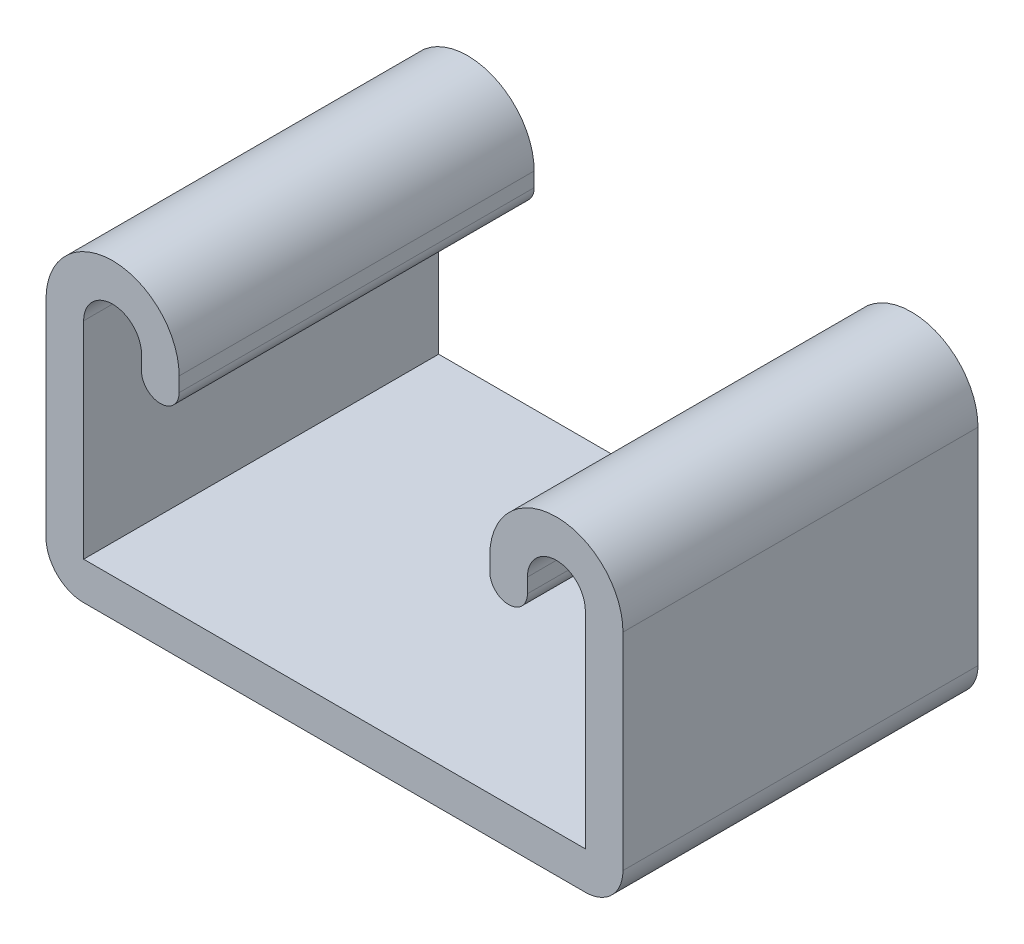
ISO-10303-21;
HEADER;
FILE_DESCRIPTION(('STEP AP214'),'2;1');
FILE_NAME('part.step','',(''),(''),'','','');
FILE_SCHEMA(('AUTOMOTIVE_DESIGN { 1 0 10303 214 1 1 1 1 }'));
ENDSEC;
DATA;
#1=APPLICATION_CONTEXT('core data for automotive mechanical design processes');
#2=APPLICATION_PROTOCOL_DEFINITION('international standard','automotive_design',2000,#1);
#3=PRODUCT_CONTEXT('',#1,'mechanical');
#4=PRODUCT('Part','Part','',(#3));
#5=PRODUCT_RELATED_PRODUCT_CATEGORY('part','',(#4));
#6=PRODUCT_DEFINITION_FORMATION('','',#4);
#7=PRODUCT_DEFINITION_CONTEXT('part definition',#1,'design');
#8=PRODUCT_DEFINITION('design','',#6,#7);
#9=PRODUCT_DEFINITION_SHAPE('','',#8);
#10=(LENGTH_UNIT() NAMED_UNIT(*) SI_UNIT(.MILLI.,.METRE.));
#11=(NAMED_UNIT(*) PLANE_ANGLE_UNIT() SI_UNIT($,.RADIAN.));
#12=(NAMED_UNIT(*) SI_UNIT($,.STERADIAN.) SOLID_ANGLE_UNIT());
#13=UNCERTAINTY_MEASURE_WITH_UNIT(LENGTH_MEASURE(1.E-05),#10,'distance_accuracy_value','');
#14=(GEOMETRIC_REPRESENTATION_CONTEXT(3) GLOBAL_UNCERTAINTY_ASSIGNED_CONTEXT((#13)) GLOBAL_UNIT_ASSIGNED_CONTEXT((#10,
#11,#12)) REPRESENTATION_CONTEXT('',''));
#15=CARTESIAN_POINT('',(0.,0.,0.));
#16=DIRECTION('',(0.,0.,1.));
#17=DIRECTION('',(1.,0.,0.));
#18=AXIS2_PLACEMENT_3D('',#15,#16,#17);
#19=CARTESIAN_POINT('',(-15.875,8.3693,12.7));
#20=DIRECTION('',(0.,0.,-1.));
#21=DIRECTION('',(-1.,0.,0.));
#22=AXIS2_PLACEMENT_3D('',#19,#20,#21);
#23=CYLINDRICAL_SURFACE('',#22,4.7625);
#24=CARTESIAN_POINT('',(-15.875,8.3693,-12.7));
#25=DIRECTION('',(0.,0.,1.));
#26=DIRECTION('',(-1.,0.,0.));
#27=AXIS2_PLACEMENT_3D('',#24,#25,#26);
#28=CIRCLE('',#27,4.7625);
#29=CARTESIAN_POINT('',(-11.1125,8.3693,-12.7));
#30=VERTEX_POINT('',#29);
#31=CARTESIAN_POINT('',(-20.6375,8.3693,-12.7));
#32=VERTEX_POINT('',#31);
#33=EDGE_CURVE('E188',#30,#32,#28,.T.);
#34=ORIENTED_EDGE('',*,*,#33,.T.);
#35=DIRECTION('',(0.,0.,-1.));
#36=VECTOR('',#35,1.);
#37=CARTESIAN_POINT('',(-20.6375,8.3693,12.7));
#38=LINE('',#37,#36);
#39=CARTESIAN_POINT('',(-20.6375,8.3693,12.7));
#40=VERTEX_POINT('',#39);
#41=EDGE_CURVE('E11',#40,#32,#38,.T.);
#42=ORIENTED_EDGE('',*,*,#41,.F.);
#43=CARTESIAN_POINT('',(-15.875,8.3693,12.7));
#44=DIRECTION('',(0.,0.,1.));
#45=DIRECTION('',(-1.,0.,0.));
#46=AXIS2_PLACEMENT_3D('',#43,#44,#45);
#47=CIRCLE('',#46,4.7625);
#48=CARTESIAN_POINT('',(-11.1125,8.3693,12.7));
#49=VERTEX_POINT('',#48);
#50=EDGE_CURVE('E222',#49,#40,#47,.T.);
#51=ORIENTED_EDGE('',*,*,#50,.F.);
#52=DIRECTION('',(0.,0.,-1.));
#53=VECTOR('',#52,1.);
#54=CARTESIAN_POINT('',(-11.1125,8.3693,12.7));
#55=LINE('',#54,#53);
#56=EDGE_CURVE('E184',#49,#30,#55,.T.);
#57=ORIENTED_EDGE('',*,*,#56,.T.);
#58=EDGE_LOOP('',(#34,#42,#51,#57));
#59=FACE_BOUND('',#58,.T.);
#60=ADVANCED_FACE('F32',(#59),#23,.T.);
#61=CARTESIAN_POINT('',(-20.6375,8.3693,12.7));
#62=DIRECTION('',(1.,0.,0.));
#63=DIRECTION('',(0.,1.,0.));
#64=AXIS2_PLACEMENT_3D('',#61,#62,#63);
#65=PLANE('',#64);
#66=DIRECTION('',(0.,-1.,0.));
#67=VECTOR('',#66,1.);
#68=CARTESIAN_POINT('',(-20.6375,8.3693,-12.7));
#69=LINE('',#68,#67);
#70=CARTESIAN_POINT('',(-20.6375,-6.4008,-12.7));
#71=VERTEX_POINT('',#70);
#72=EDGE_CURVE('E191',#32,#71,#69,.T.);
#73=ORIENTED_EDGE('',*,*,#72,.T.);
#74=DIRECTION('',(0.,0.,-1.));
#75=VECTOR('',#74,1.);
#76=CARTESIAN_POINT('',(-20.6375,-6.4008,12.7));
#77=LINE('',#76,#75);
#78=CARTESIAN_POINT('',(-20.6375,-6.4008,12.7));
#79=VERTEX_POINT('',#78);
#80=EDGE_CURVE('E40',#79,#71,#77,.T.);
#81=ORIENTED_EDGE('',*,*,#80,.F.);
#82=DIRECTION('',(0.,-1.,0.));
#83=VECTOR('',#82,1.);
#84=CARTESIAN_POINT('',(-20.6375,8.3693,12.7));
#85=LINE('',#84,#83);
#86=EDGE_CURVE('E121',#40,#79,#85,.T.);
#87=ORIENTED_EDGE('',*,*,#86,.F.);
#88=ORIENTED_EDGE('',*,*,#41,.T.);
#89=EDGE_LOOP('',(#73,#81,#87,#88));
#90=FACE_BOUND('',#89,.T.);
#91=ADVANCED_FACE('F330',(#90),#65,.F.);
#92=CARTESIAN_POINT('',(-17.9451,-6.4008,12.7));
#93=DIRECTION('',(0.,0.,-1.));
#94=DIRECTION('',(-1.,0.,0.));
#95=AXIS2_PLACEMENT_3D('',#92,#93,#94);
#96=CYLINDRICAL_SURFACE('',#95,2.6924);
#97=CARTESIAN_POINT('',(-17.9451,-6.4008,-12.7));
#98=DIRECTION('',(0.,0.,1.));
#99=DIRECTION('',(-1.,0.,0.));
#100=AXIS2_PLACEMENT_3D('',#97,#98,#99);
#101=CIRCLE('',#100,2.6924);
#102=CARTESIAN_POINT('',(-17.9451,-9.0932,-12.7));
#103=VERTEX_POINT('',#102);
#104=EDGE_CURVE('E193',#71,#103,#101,.T.);
#105=ORIENTED_EDGE('',*,*,#104,.T.);
#106=DIRECTION('',(0.,0.,-1.));
#107=VECTOR('',#106,1.);
#108=CARTESIAN_POINT('',(-17.9451,-9.0932,12.7));
#109=LINE('',#108,#107);
#110=CARTESIAN_POINT('',(-17.9451,-9.0932,12.7));
#111=VERTEX_POINT('',#110);
#112=EDGE_CURVE('E259',#111,#103,#109,.T.);
#113=ORIENTED_EDGE('',*,*,#112,.F.);
#114=CARTESIAN_POINT('',(-17.9451,-6.4008,12.7));
#115=DIRECTION('',(0.,0.,1.));
#116=DIRECTION('',(-1.,0.,0.));
#117=AXIS2_PLACEMENT_3D('',#114,#115,#116);
#118=CIRCLE('',#117,2.6924);
#119=EDGE_CURVE('E267',#79,#111,#118,.T.);
#120=ORIENTED_EDGE('',*,*,#119,.F.);
#121=ORIENTED_EDGE('',*,*,#80,.T.);
#122=EDGE_LOOP('',(#105,#113,#120,#121));
#123=FACE_BOUND('',#122,.T.);
#124=ADVANCED_FACE('F265',(#123),#96,.T.);
#125=CARTESIAN_POINT('',(-17.9451,-9.0932,12.7));
#126=DIRECTION('',(0.,1.,0.));
#127=DIRECTION('',(0.,0.,1.));
#128=AXIS2_PLACEMENT_3D('',#125,#126,#127);
#129=PLANE('',#128);
#130=DIRECTION('',(1.,0.,0.));
#131=VECTOR('',#130,1.);
#132=CARTESIAN_POINT('',(-17.9451,-9.0932,-12.7));
#133=LINE('',#132,#131);
#134=CARTESIAN_POINT('',(17.9451,-9.0932,-12.7));
#135=VERTEX_POINT('',#134);
#136=EDGE_CURVE('E195',#103,#135,#133,.T.);
#137=ORIENTED_EDGE('',*,*,#136,.T.);
#138=DIRECTION('',(0.,0.,-1.));
#139=VECTOR('',#138,1.);
#140=CARTESIAN_POINT('',(17.9451,-9.0932,12.7));
#141=LINE('',#140,#139);
#142=CARTESIAN_POINT('',(17.9451,-9.0932,12.7));
#143=VERTEX_POINT('',#142);
#144=EDGE_CURVE('E256',#143,#135,#141,.T.);
#145=ORIENTED_EDGE('',*,*,#144,.F.);
#146=DIRECTION('',(1.,0.,0.));
#147=VECTOR('',#146,1.);
#148=CARTESIAN_POINT('',(-17.9451,-9.0932,12.7));
#149=LINE('',#148,#147);
#150=EDGE_CURVE('E285',#111,#143,#149,.T.);
#151=ORIENTED_EDGE('',*,*,#150,.F.);
#152=ORIENTED_EDGE('',*,*,#112,.T.);
#153=EDGE_LOOP('',(#137,#145,#151,#152));
#154=FACE_BOUND('',#153,.T.);
#155=ADVANCED_FACE('F276',(#154),#129,.F.);
#156=CARTESIAN_POINT('',(17.9451,-6.4008,12.7));
#157=DIRECTION('',(0.,0.,-1.));
#158=DIRECTION('',(-1.,0.,0.));
#159=AXIS2_PLACEMENT_3D('',#156,#157,#158);
#160=CYLINDRICAL_SURFACE('',#159,2.6924);
#161=CARTESIAN_POINT('',(17.9451,-6.4008,-12.7));
#162=DIRECTION('',(0.,0.,1.));
#163=DIRECTION('',(1.,0.,0.));
#164=AXIS2_PLACEMENT_3D('',#161,#162,#163);
#165=CIRCLE('',#164,2.6924);
#166=CARTESIAN_POINT('',(20.6375,-6.4008,-12.7));
#167=VERTEX_POINT('',#166);
#168=EDGE_CURVE('E197',#135,#167,#165,.T.);
#169=ORIENTED_EDGE('',*,*,#168,.T.);
#170=DIRECTION('',(0.,0.,-1.));
#171=VECTOR('',#170,1.);
#172=CARTESIAN_POINT('',(20.6375,-6.4008,12.7));
#173=LINE('',#172,#171);
#174=CARTESIAN_POINT('',(20.6375,-6.4008,12.7));
#175=VERTEX_POINT('',#174);
#176=EDGE_CURVE('E253',#175,#167,#173,.T.);
#177=ORIENTED_EDGE('',*,*,#176,.F.);
#178=CARTESIAN_POINT('',(17.9451,-6.4008,12.7));
#179=DIRECTION('',(0.,0.,1.));
#180=DIRECTION('',(1.,0.,0.));
#181=AXIS2_PLACEMENT_3D('',#178,#179,#180);
#182=CIRCLE('',#181,2.6924);
#183=EDGE_CURVE('E282',#143,#175,#182,.T.);
#184=ORIENTED_EDGE('',*,*,#183,.F.);
#185=ORIENTED_EDGE('',*,*,#144,.T.);
#186=EDGE_LOOP('',(#169,#177,#184,#185));
#187=FACE_BOUND('',#186,.T.);
#188=ADVANCED_FACE('F280',(#187),#160,.T.);
#189=CARTESIAN_POINT('',(20.6375,-6.4008,12.7));
#190=DIRECTION('',(-1.,0.,0.));
#191=DIRECTION('',(0.,-1.,0.));
#192=AXIS2_PLACEMENT_3D('',#189,#190,#191);
#193=PLANE('',#192);
#194=DIRECTION('',(0.,1.,0.));
#195=VECTOR('',#194,1.);
#196=CARTESIAN_POINT('',(20.6375,-6.4008,-12.7));
#197=LINE('',#196,#195);
#198=CARTESIAN_POINT('',(20.6375,8.3693,-12.7));
#199=VERTEX_POINT('',#198);
#200=EDGE_CURVE('E199',#167,#199,#197,.T.);
#201=ORIENTED_EDGE('',*,*,#200,.T.);
#202=DIRECTION('',(0.,0.,-1.));
#203=VECTOR('',#202,1.);
#204=CARTESIAN_POINT('',(20.6375,8.3693,12.7));
#205=LINE('',#204,#203);
#206=CARTESIAN_POINT('',(20.6375,8.3693,12.7));
#207=VERTEX_POINT('',#206);
#208=EDGE_CURVE('E250',#207,#199,#205,.T.);
#209=ORIENTED_EDGE('',*,*,#208,.F.);
#210=DIRECTION('',(0.,1.,0.));
#211=VECTOR('',#210,1.);
#212=CARTESIAN_POINT('',(20.6375,-6.4008,12.7));
#213=LINE('',#212,#211);
#214=EDGE_CURVE('E284',#175,#207,#213,.T.);
#215=ORIENTED_EDGE('',*,*,#214,.F.);
#216=ORIENTED_EDGE('',*,*,#176,.T.);
#217=EDGE_LOOP('',(#201,#209,#215,#216));
#218=FACE_BOUND('',#217,.T.);
#219=ADVANCED_FACE('F343',(#218),#193,.F.);
#220=CARTESIAN_POINT('',(15.875,8.3693,12.7));
#221=DIRECTION('',(0.,0.,-1.));
#222=DIRECTION('',(-1.,0.,0.));
#223=AXIS2_PLACEMENT_3D('',#220,#221,#222);
#224=CYLINDRICAL_SURFACE('',#223,4.7625);
#225=CARTESIAN_POINT('',(15.875,8.3693,-12.7));
#226=DIRECTION('',(0.,0.,1.));
#227=DIRECTION('',(1.,0.,0.));
#228=AXIS2_PLACEMENT_3D('',#225,#226,#227);
#229=CIRCLE('',#228,4.7625);
#230=CARTESIAN_POINT('',(11.1125,8.3693,-12.7));
#231=VERTEX_POINT('',#230);
#232=EDGE_CURVE('E201',#199,#231,#229,.T.);
#233=ORIENTED_EDGE('',*,*,#232,.T.);
#234=DIRECTION('',(0.,0.,-1.));
#235=VECTOR('',#234,1.);
#236=CARTESIAN_POINT('',(11.1125,8.3693,12.7));
#237=LINE('',#236,#235);
#238=CARTESIAN_POINT('',(11.1125,8.3693,12.7));
#239=VERTEX_POINT('',#238);
#240=EDGE_CURVE('E247',#239,#231,#237,.T.);
#241=ORIENTED_EDGE('',*,*,#240,.F.);
#242=CARTESIAN_POINT('',(15.875,8.3693,12.7));
#243=DIRECTION('',(0.,0.,1.));
#244=DIRECTION('',(1.,0.,0.));
#245=AXIS2_PLACEMENT_3D('',#242,#243,#244);
#246=CIRCLE('',#245,4.7625);
#247=EDGE_CURVE('E287',#207,#239,#246,.T.);
#248=ORIENTED_EDGE('',*,*,#247,.F.);
#249=ORIENTED_EDGE('',*,*,#208,.T.);
#250=EDGE_LOOP('',(#233,#241,#248,#249));
#251=FACE_BOUND('',#250,.T.);
#252=ADVANCED_FACE('F346',(#251),#224,.T.);
#253=CARTESIAN_POINT('',(11.1125,8.3693,12.7));
#254=DIRECTION('',(1.,0.,0.));
#255=DIRECTION('',(0.,0.,-1.));
#256=AXIS2_PLACEMENT_3D('',#253,#254,#255);
#257=PLANE('',#256);
#258=DIRECTION('',(0.,-1.,0.));
#259=VECTOR('',#258,1.);
#260=CARTESIAN_POINT('',(11.1125,8.3693,-12.7));
#261=LINE('',#260,#259);
#262=CARTESIAN_POINT('',(11.1125,7.33425,-12.7));
#263=VERTEX_POINT('',#262);
#264=EDGE_CURVE('E203',#231,#263,#261,.T.);
#265=ORIENTED_EDGE('',*,*,#264,.T.);
#266=DIRECTION('',(0.,0.,-1.));
#267=VECTOR('',#266,1.);
#268=CARTESIAN_POINT('',(11.1125,7.33425,12.7));
#269=LINE('',#268,#267);
#270=CARTESIAN_POINT('',(11.1125,7.33425,12.7));
#271=VERTEX_POINT('',#270);
#272=EDGE_CURVE('E244',#271,#263,#269,.T.);
#273=ORIENTED_EDGE('',*,*,#272,.F.);
#274=DIRECTION('',(0.,-1.,0.));
#275=VECTOR('',#274,1.);
#276=CARTESIAN_POINT('',(11.1125,8.3693,12.7));
#277=LINE('',#276,#275);
#278=EDGE_CURVE('E293',#239,#271,#277,.T.);
#279=ORIENTED_EDGE('',*,*,#278,.F.);
#280=ORIENTED_EDGE('',*,*,#240,.T.);
#281=EDGE_LOOP('',(#265,#273,#279,#280));
#282=FACE_BOUND('',#281,.T.);
#283=ADVANCED_FACE('F350',(#282),#257,.F.);
#284=CARTESIAN_POINT('',(12.4587,7.33425,12.7));
#285=DIRECTION('',(0.,0.,-1.));
#286=DIRECTION('',(-1.,0.,0.));
#287=AXIS2_PLACEMENT_3D('',#284,#285,#286);
#288=CYLINDRICAL_SURFACE('',#287,1.3462);
#289=CARTESIAN_POINT('',(12.4587,7.33425,-12.7));
#290=DIRECTION('',(0.,0.,1.));
#291=DIRECTION('',(1.,0.,0.));
#292=AXIS2_PLACEMENT_3D('',#289,#290,#291);
#293=CIRCLE('',#292,1.3462);
#294=CARTESIAN_POINT('',(13.8049,7.33425,-12.7));
#295=VERTEX_POINT('',#294);
#296=EDGE_CURVE('E205',#263,#295,#293,.T.);
#297=ORIENTED_EDGE('',*,*,#296,.T.);
#298=DIRECTION('',(0.,0.,-1.));
#299=VECTOR('',#298,1.);
#300=CARTESIAN_POINT('',(13.8049,7.33425,12.7));
#301=LINE('',#300,#299);
#302=CARTESIAN_POINT('',(13.8049,7.33425,12.7));
#303=VERTEX_POINT('',#302);
#304=EDGE_CURVE('E241',#303,#295,#301,.T.);
#305=ORIENTED_EDGE('',*,*,#304,.F.);
#306=CARTESIAN_POINT('',(12.4587,7.33425,12.7));
#307=DIRECTION('',(0.,0.,1.));
#308=DIRECTION('',(1.,0.,0.));
#309=AXIS2_PLACEMENT_3D('',#306,#307,#308);
#310=CIRCLE('',#309,1.3462);
#311=EDGE_CURVE('E295',#271,#303,#310,.T.);
#312=ORIENTED_EDGE('',*,*,#311,.F.);
#313=ORIENTED_EDGE('',*,*,#272,.T.);
#314=EDGE_LOOP('',(#297,#305,#312,#313));
#315=FACE_BOUND('',#314,.T.);
#316=ADVANCED_FACE('F354',(#315),#288,.T.);
#317=CARTESIAN_POINT('',(13.8049,8.3693,12.7));
#318=DIRECTION('',(-1.,0.,0.));
#319=DIRECTION('',(0.,0.,1.));
#320=AXIS2_PLACEMENT_3D('',#317,#318,#319);
#321=PLANE('',#320);
#322=DIRECTION('',(0.,1.,0.));
#323=VECTOR('',#322,1.);
#324=CARTESIAN_POINT('',(13.8049,8.3693,-12.7));
#325=LINE('',#324,#323);
#326=CARTESIAN_POINT('',(13.8049,8.3693,-12.7));
#327=VERTEX_POINT('',#326);
#328=EDGE_CURVE('E207',#295,#327,#325,.T.);
#329=ORIENTED_EDGE('',*,*,#328,.T.);
#330=DIRECTION('',(0.,0.,-1.));
#331=VECTOR('',#330,1.);
#332=CARTESIAN_POINT('',(13.8049,8.3693,12.7));
#333=LINE('',#332,#331);
#334=CARTESIAN_POINT('',(13.8049,8.3693,12.7));
#335=VERTEX_POINT('',#334);
#336=EDGE_CURVE('E238',#335,#327,#333,.T.);
#337=ORIENTED_EDGE('',*,*,#336,.F.);
#338=DIRECTION('',(0.,1.,0.));
#339=VECTOR('',#338,1.);
#340=CARTESIAN_POINT('',(13.8049,8.3693,12.7));
#341=LINE('',#340,#339);
#342=EDGE_CURVE('E297',#303,#335,#341,.T.);
#343=ORIENTED_EDGE('',*,*,#342,.F.);
#344=ORIENTED_EDGE('',*,*,#304,.T.);
#345=EDGE_LOOP('',(#329,#337,#343,#344));
#346=FACE_BOUND('',#345,.T.);
#347=ADVANCED_FACE('F358',(#346),#321,.F.);
#348=CARTESIAN_POINT('',(15.875,8.3693,12.7));
#349=DIRECTION('',(0.,0.,-1.));
#350=DIRECTION('',(-1.,0.,0.));
#351=AXIS2_PLACEMENT_3D('',#348,#349,#350);
#352=CYLINDRICAL_SURFACE('',#351,2.0701);
#353=CARTESIAN_POINT('',(15.875,8.3693,-12.7));
#354=DIRECTION('',(0.,0.,-1.));
#355=DIRECTION('',(1.,0.,0.));
#356=AXIS2_PLACEMENT_3D('',#353,#354,#355);
#357=CIRCLE('',#356,2.0701);
#358=CARTESIAN_POINT('',(17.9451,8.3693,-12.7));
#359=VERTEX_POINT('',#358);
#360=EDGE_CURVE('E209',#327,#359,#357,.T.);
#361=ORIENTED_EDGE('',*,*,#360,.T.);
#362=DIRECTION('',(0.,0.,-1.));
#363=VECTOR('',#362,1.);
#364=CARTESIAN_POINT('',(17.9451,8.3693,12.7));
#365=LINE('',#364,#363);
#366=CARTESIAN_POINT('',(17.9451,8.3693,12.7));
#367=VERTEX_POINT('',#366);
#368=EDGE_CURVE('E235',#367,#359,#365,.T.);
#369=ORIENTED_EDGE('',*,*,#368,.F.);
#370=CARTESIAN_POINT('',(15.875,8.3693,12.7));
#371=DIRECTION('',(0.,0.,-1.));
#372=DIRECTION('',(1.,0.,0.));
#373=AXIS2_PLACEMENT_3D('',#370,#371,#372);
#374=CIRCLE('',#373,2.0701);
#375=EDGE_CURVE('E299',#335,#367,#374,.T.);
#376=ORIENTED_EDGE('',*,*,#375,.F.);
#377=ORIENTED_EDGE('',*,*,#336,.T.);
#378=EDGE_LOOP('',(#361,#369,#376,#377));
#379=FACE_BOUND('',#378,.T.);
#380=ADVANCED_FACE('F362',(#379),#352,.F.);
#381=CARTESIAN_POINT('',(17.9451,-6.4008,12.7));
#382=DIRECTION('',(1.,0.,0.));
#383=DIRECTION('',(0.,1.,0.));
#384=AXIS2_PLACEMENT_3D('',#381,#382,#383);
#385=PLANE('',#384);
#386=DIRECTION('',(0.,-1.,0.));
#387=VECTOR('',#386,1.);
#388=CARTESIAN_POINT('',(17.9451,-6.4008,-12.7));
#389=LINE('',#388,#387);
#390=CARTESIAN_POINT('',(17.9451,-6.4008,-12.7));
#391=VERTEX_POINT('',#390);
#392=EDGE_CURVE('E211',#359,#391,#389,.T.);
#393=ORIENTED_EDGE('',*,*,#392,.T.);
#394=DIRECTION('',(0.,0.,-1.));
#395=VECTOR('',#394,1.);
#396=CARTESIAN_POINT('',(17.9451,-6.4008,12.7));
#397=LINE('',#396,#395);
#398=CARTESIAN_POINT('',(17.9451,-6.4008,12.7));
#399=VERTEX_POINT('',#398);
#400=EDGE_CURVE('E232',#399,#391,#397,.T.);
#401=ORIENTED_EDGE('',*,*,#400,.F.);
#402=DIRECTION('',(0.,-1.,0.));
#403=VECTOR('',#402,1.);
#404=CARTESIAN_POINT('',(17.9451,-6.4008,12.7));
#405=LINE('',#404,#403);
#406=EDGE_CURVE('E301',#367,#399,#405,.T.);
#407=ORIENTED_EDGE('',*,*,#406,.F.);
#408=ORIENTED_EDGE('',*,*,#368,.T.);
#409=EDGE_LOOP('',(#393,#401,#407,#408));
#410=FACE_BOUND('',#409,.T.);
#411=ADVANCED_FACE('F366',(#410),#385,.F.);
#412=CARTESIAN_POINT('',(-17.9451,-6.4008,12.7));
#413=DIRECTION('',(0.,-1.,0.));
#414=DIRECTION('',(0.,0.,-1.));
#415=AXIS2_PLACEMENT_3D('',#412,#413,#414);
#416=PLANE('',#415);
#417=DIRECTION('',(-1.,0.,0.));
#418=VECTOR('',#417,1.);
#419=CARTESIAN_POINT('',(-17.9451,-6.4008,-12.7));
#420=LINE('',#419,#418);
#421=CARTESIAN_POINT('',(-17.9451,-6.4008,-12.7));
#422=VERTEX_POINT('',#421);
#423=EDGE_CURVE('E213',#391,#422,#420,.T.);
#424=ORIENTED_EDGE('',*,*,#423,.T.);
#425=DIRECTION('',(0.,0.,-1.));
#426=VECTOR('',#425,1.);
#427=CARTESIAN_POINT('',(-17.9451,-6.4008,12.7));
#428=LINE('',#427,#426);
#429=CARTESIAN_POINT('',(-17.9451,-6.4008,12.7));
#430=VERTEX_POINT('',#429);
#431=EDGE_CURVE('E229',#430,#422,#428,.T.);
#432=ORIENTED_EDGE('',*,*,#431,.F.);
#433=DIRECTION('',(-1.,0.,0.));
#434=VECTOR('',#433,1.);
#435=CARTESIAN_POINT('',(-17.9451,-6.4008,12.7));
#436=LINE('',#435,#434);
#437=EDGE_CURVE('E303',#399,#430,#436,.T.);
#438=ORIENTED_EDGE('',*,*,#437,.F.);
#439=ORIENTED_EDGE('',*,*,#400,.T.);
#440=EDGE_LOOP('',(#424,#432,#438,#439));
#441=FACE_BOUND('',#440,.T.);
#442=ADVANCED_FACE('F370',(#441),#416,.F.);
#443=CARTESIAN_POINT('',(-17.9451,8.3693,12.7));
#444=DIRECTION('',(-1.,0.,0.));
#445=DIRECTION('',(0.,-1.,0.));
#446=AXIS2_PLACEMENT_3D('',#443,#444,#445);
#447=PLANE('',#446);
#448=DIRECTION('',(0.,1.,0.));
#449=VECTOR('',#448,1.);
#450=CARTESIAN_POINT('',(-17.9451,8.3693,-12.7));
#451=LINE('',#450,#449);
#452=CARTESIAN_POINT('',(-17.9451,8.3693,-12.7));
#453=VERTEX_POINT('',#452);
#454=EDGE_CURVE('E215',#422,#453,#451,.T.);
#455=ORIENTED_EDGE('',*,*,#454,.T.);
#456=DIRECTION('',(0.,0.,-1.));
#457=VECTOR('',#456,1.);
#458=CARTESIAN_POINT('',(-17.9451,8.3693,12.7));
#459=LINE('',#458,#457);
#460=CARTESIAN_POINT('',(-17.9451,8.3693,12.7));
#461=VERTEX_POINT('',#460);
#462=EDGE_CURVE('E226',#461,#453,#459,.T.);
#463=ORIENTED_EDGE('',*,*,#462,.F.);
#464=DIRECTION('',(0.,1.,0.));
#465=VECTOR('',#464,1.);
#466=CARTESIAN_POINT('',(-17.9451,8.3693,12.7));
#467=LINE('',#466,#465);
#468=EDGE_CURVE('E305',#430,#461,#467,.T.);
#469=ORIENTED_EDGE('',*,*,#468,.F.);
#470=ORIENTED_EDGE('',*,*,#431,.T.);
#471=EDGE_LOOP('',(#455,#463,#469,#470));
#472=FACE_BOUND('',#471,.T.);
#473=ADVANCED_FACE('F311',(#472),#447,.F.);
#474=CARTESIAN_POINT('',(-15.875,8.3693,12.7));
#475=DIRECTION('',(0.,0.,-1.));
#476=DIRECTION('',(-1.,0.,0.));
#477=AXIS2_PLACEMENT_3D('',#474,#475,#476);
#478=CYLINDRICAL_SURFACE('',#477,2.0701);
#479=CARTESIAN_POINT('',(-15.875,8.3693,-12.7));
#480=DIRECTION('',(0.,0.,-1.));
#481=DIRECTION('',(-1.,0.,0.));
#482=AXIS2_PLACEMENT_3D('',#479,#480,#481);
#483=CIRCLE('',#482,2.0701);
#484=CARTESIAN_POINT('',(-13.8049,8.3693,-12.7));
#485=VERTEX_POINT('',#484);
#486=EDGE_CURVE('E217',#453,#485,#483,.T.);
#487=ORIENTED_EDGE('',*,*,#486,.T.);
#488=DIRECTION('',(0.,0.,-1.));
#489=VECTOR('',#488,1.);
#490=CARTESIAN_POINT('',(-13.8049,8.3693,12.7));
#491=LINE('',#490,#489);
#492=CARTESIAN_POINT('',(-13.8049,8.3693,12.7));
#493=VERTEX_POINT('',#492);
#494=EDGE_CURVE('E179',#493,#485,#491,.T.);
#495=ORIENTED_EDGE('',*,*,#494,.F.);
#496=CARTESIAN_POINT('',(-15.875,8.3693,12.7));
#497=DIRECTION('',(0.,0.,-1.));
#498=DIRECTION('',(-1.,0.,0.));
#499=AXIS2_PLACEMENT_3D('',#496,#497,#498);
#500=CIRCLE('',#499,2.0701);
#501=EDGE_CURVE('E170',#461,#493,#500,.T.);
#502=ORIENTED_EDGE('',*,*,#501,.F.);
#503=ORIENTED_EDGE('',*,*,#462,.T.);
#504=EDGE_LOOP('',(#487,#495,#502,#503));
#505=FACE_BOUND('',#504,.T.);
#506=ADVANCED_FACE('F315',(#505),#478,.F.);
#507=CARTESIAN_POINT('',(-13.8049,8.3693,12.7));
#508=DIRECTION('',(1.,0.,0.));
#509=DIRECTION('',(0.,1.,0.));
#510=AXIS2_PLACEMENT_3D('',#507,#508,#509);
#511=PLANE('',#510);
#512=DIRECTION('',(0.,-1.,0.));
#513=VECTOR('',#512,1.);
#514=CARTESIAN_POINT('',(-13.8049,8.3693,-12.7));
#515=LINE('',#514,#513);
#516=CARTESIAN_POINT('',(-13.8049,7.33425,-12.7));
#517=VERTEX_POINT('',#516);
#518=EDGE_CURVE('E178',#485,#517,#515,.T.);
#519=ORIENTED_EDGE('',*,*,#518,.T.);
#520=DIRECTION('',(0.,0.,-1.));
#521=VECTOR('',#520,1.);
#522=CARTESIAN_POINT('',(-13.8049,7.33425,12.7));
#523=LINE('',#522,#521);
#524=CARTESIAN_POINT('',(-13.8049,7.33425,12.7));
#525=VERTEX_POINT('',#524);
#526=EDGE_CURVE('E175',#525,#517,#523,.T.);
#527=ORIENTED_EDGE('',*,*,#526,.F.);
#528=DIRECTION('',(0.,-1.,0.));
#529=VECTOR('',#528,1.);
#530=CARTESIAN_POINT('',(-13.8049,8.3693,12.7));
#531=LINE('',#530,#529);
#532=EDGE_CURVE('E164',#493,#525,#531,.T.);
#533=ORIENTED_EDGE('',*,*,#532,.F.);
#534=ORIENTED_EDGE('',*,*,#494,.T.);
#535=EDGE_LOOP('',(#519,#527,#533,#534));
#536=FACE_BOUND('',#535,.T.);
#537=ADVANCED_FACE('F176',(#536),#511,.F.);
#538=CARTESIAN_POINT('',(-12.4587,7.33425,12.7));
#539=DIRECTION('',(0.,0.,-1.));
#540=DIRECTION('',(-1.,0.,0.));
#541=AXIS2_PLACEMENT_3D('',#538,#539,#540);
#542=CYLINDRICAL_SURFACE('',#541,1.3462);
#543=CARTESIAN_POINT('',(-12.4587,7.33425,-12.7));
#544=DIRECTION('',(0.,0.,1.));
#545=DIRECTION('',(-1.,0.,0.));
#546=AXIS2_PLACEMENT_3D('',#543,#544,#545);
#547=CIRCLE('',#546,1.3462);
#548=CARTESIAN_POINT('',(-11.1125,7.33425,-12.7));
#549=VERTEX_POINT('',#548);
#550=EDGE_CURVE('E107',#517,#549,#547,.T.);
#551=ORIENTED_EDGE('',*,*,#550,.T.);
#552=DIRECTION('',(0.,0.,-1.));
#553=VECTOR('',#552,1.);
#554=CARTESIAN_POINT('',(-11.1125,7.33425,12.7));
#555=LINE('',#554,#553);
#556=CARTESIAN_POINT('',(-11.1125,7.33425,12.7));
#557=VERTEX_POINT('',#556);
#558=EDGE_CURVE('E180',#557,#549,#555,.T.);
#559=ORIENTED_EDGE('',*,*,#558,.F.);
#560=CARTESIAN_POINT('',(-12.4587,7.33425,12.7));
#561=DIRECTION('',(0.,0.,1.));
#562=DIRECTION('',(-1.,0.,0.));
#563=AXIS2_PLACEMENT_3D('',#560,#561,#562);
#564=CIRCLE('',#563,1.3462);
#565=EDGE_CURVE('E168',#525,#557,#564,.T.);
#566=ORIENTED_EDGE('',*,*,#565,.F.);
#567=ORIENTED_EDGE('',*,*,#526,.T.);
#568=EDGE_LOOP('',(#551,#559,#566,#567));
#569=FACE_BOUND('',#568,.T.);
#570=ADVANCED_FACE('F182',(#569),#542,.T.);
#571=CARTESIAN_POINT('',(-11.1125,8.3693,12.7));
#572=DIRECTION('',(-1.,0.,0.));
#573=DIRECTION('',(0.,0.,1.));
#574=AXIS2_PLACEMENT_3D('',#571,#572,#573);
#575=PLANE('',#574);
#576=DIRECTION('',(0.,1.,0.));
#577=VECTOR('',#576,1.);
#578=CARTESIAN_POINT('',(-11.1125,8.3693,-12.7));
#579=LINE('',#578,#577);
#580=EDGE_CURVE('E113',#549,#30,#579,.T.);
#581=ORIENTED_EDGE('',*,*,#580,.T.);
#582=ORIENTED_EDGE('',*,*,#56,.F.);
#583=DIRECTION('',(0.,1.,0.));
#584=VECTOR('',#583,1.);
#585=CARTESIAN_POINT('',(-11.1125,8.3693,12.7));
#586=LINE('',#585,#584);
#587=EDGE_CURVE('E48',#557,#49,#586,.T.);
#588=ORIENTED_EDGE('',*,*,#587,.F.);
#589=ORIENTED_EDGE('',*,*,#558,.T.);
#590=EDGE_LOOP('',(#581,#582,#588,#589));
#591=FACE_BOUND('',#590,.T.);
#592=ADVANCED_FACE('F319',(#591),#575,.F.);
#593=CARTESIAN_POINT('',(-15.875,8.3693,12.7));
#594=DIRECTION('',(0.,0.,-1.));
#595=DIRECTION('',(-1.,0.,0.));
#596=AXIS2_PLACEMENT_3D('',#593,#594,#595);
#597=PLANE('',#596);
#598=ORIENTED_EDGE('',*,*,#50,.T.);
#599=ORIENTED_EDGE('',*,*,#86,.T.);
#600=ORIENTED_EDGE('',*,*,#119,.T.);
#601=ORIENTED_EDGE('',*,*,#150,.T.);
#602=ORIENTED_EDGE('',*,*,#183,.T.);
#603=ORIENTED_EDGE('',*,*,#214,.T.);
#604=ORIENTED_EDGE('',*,*,#247,.T.);
#605=ORIENTED_EDGE('',*,*,#278,.T.);
#606=ORIENTED_EDGE('',*,*,#311,.T.);
#607=ORIENTED_EDGE('',*,*,#342,.T.);
#608=ORIENTED_EDGE('',*,*,#375,.T.);
#609=ORIENTED_EDGE('',*,*,#406,.T.);
#610=ORIENTED_EDGE('',*,*,#437,.T.);
#611=ORIENTED_EDGE('',*,*,#468,.T.);
#612=ORIENTED_EDGE('',*,*,#501,.T.);
#613=ORIENTED_EDGE('',*,*,#532,.T.);
#614=ORIENTED_EDGE('',*,*,#565,.T.);
#615=ORIENTED_EDGE('',*,*,#587,.T.);
#616=EDGE_LOOP('',(#598,#599,#600,#601,#602,#603,#604,#605,#606,#607,#608,#609,#610,#611,#612,
#613,#614,#615));
#617=FACE_BOUND('',#616,.T.);
#618=ADVANCED_FACE('F166',(#617),#597,.F.);
#619=CARTESIAN_POINT('',(-15.875,8.3693,-12.7));
#620=DIRECTION('',(0.,0.,-1.));
#621=DIRECTION('',(-1.,0.,0.));
#622=AXIS2_PLACEMENT_3D('',#619,#620,#621);
#623=PLANE('',#622);
#624=ORIENTED_EDGE('',*,*,#33,.F.);
#625=ORIENTED_EDGE('',*,*,#580,.F.);
#626=ORIENTED_EDGE('',*,*,#550,.F.);
#627=ORIENTED_EDGE('',*,*,#518,.F.);
#628=ORIENTED_EDGE('',*,*,#486,.F.);
#629=ORIENTED_EDGE('',*,*,#454,.F.);
#630=ORIENTED_EDGE('',*,*,#423,.F.);
#631=ORIENTED_EDGE('',*,*,#392,.F.);
#632=ORIENTED_EDGE('',*,*,#360,.F.);
#633=ORIENTED_EDGE('',*,*,#328,.F.);
#634=ORIENTED_EDGE('',*,*,#296,.F.);
#635=ORIENTED_EDGE('',*,*,#264,.F.);
#636=ORIENTED_EDGE('',*,*,#232,.F.);
#637=ORIENTED_EDGE('',*,*,#200,.F.);
#638=ORIENTED_EDGE('',*,*,#168,.F.);
#639=ORIENTED_EDGE('',*,*,#136,.F.);
#640=ORIENTED_EDGE('',*,*,#104,.F.);
#641=ORIENTED_EDGE('',*,*,#72,.F.);
#642=EDGE_LOOP('',(#624,#625,#626,#627,#628,#629,#630,#631,#632,#633,#634,#635,#636,#637,#638,
#639,#640,#641));
#643=FACE_BOUND('',#642,.T.);
#644=ADVANCED_FACE('F271',(#643),#623,.T.);
#645=CLOSED_SHELL('',(#60,#91,#124,#155,#188,#219,#252,#283,#316,#347,#380,#411,#442,#473,#506,
#537,#570,#592,#618,#644));
#646=MANIFOLD_SOLID_BREP('B2',#645);
#647=ADVANCED_BREP_SHAPE_REPRESENTATION('',(#18,#646),#14);
#648=SHAPE_DEFINITION_REPRESENTATION(#9,#647);
ENDSEC;
END-ISO-10303-21;
